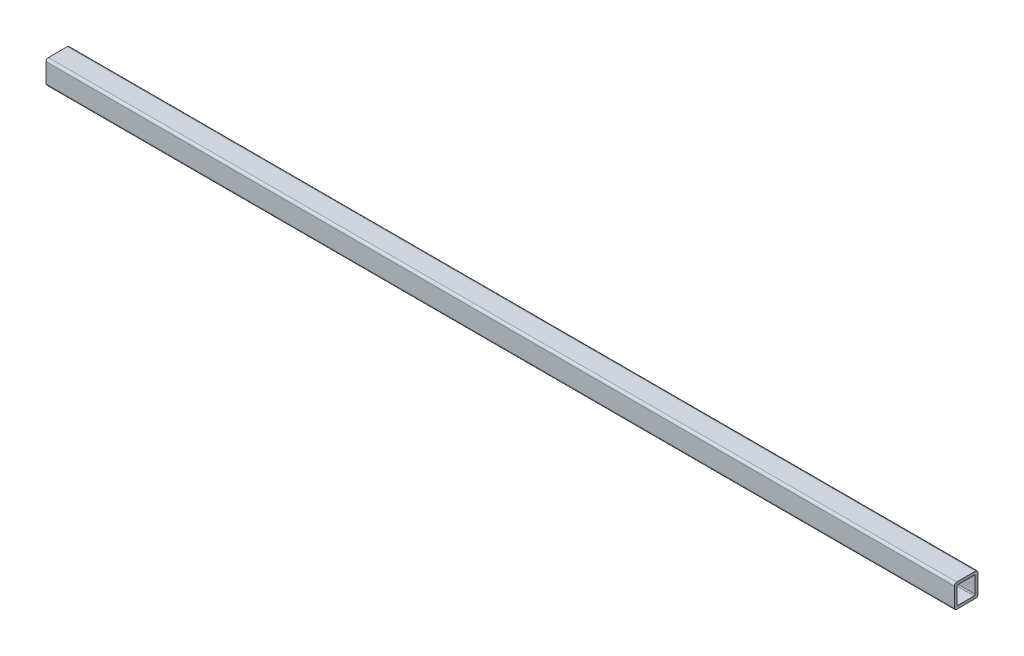
ISO-10303-21;
HEADER;
FILE_DESCRIPTION(('STEP AP214'),'2;1');
FILE_NAME('part.step','',(''),(''),'','','');
FILE_SCHEMA(('AUTOMOTIVE_DESIGN { 1 0 10303 214 1 1 1 1 }'));
ENDSEC;
DATA;
#1=APPLICATION_CONTEXT('core data for automotive mechanical design processes');
#2=APPLICATION_PROTOCOL_DEFINITION('international standard','automotive_design',2000,#1);
#3=PRODUCT_CONTEXT('',#1,'mechanical');
#4=PRODUCT('Part','Part','',(#3));
#5=PRODUCT_RELATED_PRODUCT_CATEGORY('part','',(#4));
#6=PRODUCT_DEFINITION_FORMATION('','',#4);
#7=PRODUCT_DEFINITION_CONTEXT('part definition',#1,'design');
#8=PRODUCT_DEFINITION('design','',#6,#7);
#9=PRODUCT_DEFINITION_SHAPE('','',#8);
#10=(LENGTH_UNIT() NAMED_UNIT(*) SI_UNIT(.MILLI.,.METRE.));
#11=(NAMED_UNIT(*) PLANE_ANGLE_UNIT() SI_UNIT($,.RADIAN.));
#12=(NAMED_UNIT(*) SI_UNIT($,.STERADIAN.) SOLID_ANGLE_UNIT());
#13=UNCERTAINTY_MEASURE_WITH_UNIT(LENGTH_MEASURE(1.E-05),#10,'distance_accuracy_value','');
#14=(GEOMETRIC_REPRESENTATION_CONTEXT(3) GLOBAL_UNCERTAINTY_ASSIGNED_CONTEXT((#13)) GLOBAL_UNIT_ASSIGNED_CONTEXT((#10,
#11,#12)) REPRESENTATION_CONTEXT('',''));
#15=CARTESIAN_POINT('',(0.,0.,0.));
#16=DIRECTION('',(0.,0.,1.));
#17=DIRECTION('',(1.,0.,0.));
#18=AXIS2_PLACEMENT_3D('',#15,#16,#17);
#19=CARTESIAN_POINT('',(-974.6,12.7,-12.7));
#20=DIRECTION('',(0.,0.,-1.));
#21=DIRECTION('',(0.,1.,0.));
#22=AXIS2_PLACEMENT_3D('',#19,#20,#21);
#23=PLANE('',#22);
#24=DIRECTION('',(0.,1.,0.));
#25=VECTOR('',#24,1.);
#26=CARTESIAN_POINT('',(0.,12.7,-12.7));
#27=LINE('',#26,#25);
#28=CARTESIAN_POINT('',(0.,-10.2,-12.7));
#29=VERTEX_POINT('',#28);
#30=CARTESIAN_POINT('',(0.,10.2,-12.7));
#31=VERTEX_POINT('',#30);
#32=EDGE_CURVE('E258',#29,#31,#27,.T.);
#33=ORIENTED_EDGE('',*,*,#32,.F.);
#34=DIRECTION('',(1.,0.,0.));
#35=VECTOR('',#34,1.);
#36=CARTESIAN_POINT('',(-974.6,-10.2,-12.7));
#37=LINE('',#36,#35);
#38=CARTESIAN_POINT('',(-974.6,-10.2,-12.7));
#39=VERTEX_POINT('',#38);
#40=EDGE_CURVE('E187',#29,#39,#37,.F.);
#41=ORIENTED_EDGE('',*,*,#40,.T.);
#42=DIRECTION('',(0.,1.,0.));
#43=VECTOR('',#42,1.);
#44=CARTESIAN_POINT('',(-974.6,12.7,-12.7));
#45=LINE('',#44,#43);
#46=CARTESIAN_POINT('',(-974.6,10.2,-12.7));
#47=VERTEX_POINT('',#46);
#48=EDGE_CURVE('E168',#39,#47,#45,.T.);
#49=ORIENTED_EDGE('',*,*,#48,.T.);
#50=DIRECTION('',(1.,0.,0.));
#51=VECTOR('',#50,1.);
#52=CARTESIAN_POINT('',(-974.6,10.2,-12.7));
#53=LINE('',#52,#51);
#54=EDGE_CURVE('E184',#47,#31,#53,.T.);
#55=ORIENTED_EDGE('',*,*,#54,.T.);
#56=EDGE_LOOP('',(#33,#41,#49,#55));
#57=FACE_BOUND('',#56,.T.);
#58=ADVANCED_FACE('F33',(#57),#23,.T.);
#59=CARTESIAN_POINT('',(-974.6,-12.7,12.7));
#60=DIRECTION('',(0.,-1.,0.));
#61=DIRECTION('',(0.,0.,-1.));
#62=AXIS2_PLACEMENT_3D('',#59,#60,#61);
#63=PLANE('',#62);
#64=DIRECTION('',(0.,0.,-1.));
#65=VECTOR('',#64,1.);
#66=CARTESIAN_POINT('',(-974.6,-12.7,12.7));
#67=LINE('',#66,#65);
#68=CARTESIAN_POINT('',(-974.6,-12.7,10.2));
#69=VERTEX_POINT('',#68);
#70=CARTESIAN_POINT('',(-974.6,-12.7,-10.2));
#71=VERTEX_POINT('',#70);
#72=EDGE_CURVE('E173',#69,#71,#67,.T.);
#73=ORIENTED_EDGE('',*,*,#72,.T.);
#74=DIRECTION('',(1.,0.,0.));
#75=VECTOR('',#74,1.);
#76=CARTESIAN_POINT('',(-974.6,-12.7,-10.2));
#77=LINE('',#76,#75);
#78=CARTESIAN_POINT('',(0.,-12.7,-10.2));
#79=VERTEX_POINT('',#78);
#80=EDGE_CURVE('E167',#71,#79,#77,.T.);
#81=ORIENTED_EDGE('',*,*,#80,.T.);
#82=DIRECTION('',(0.,0.,-1.));
#83=VECTOR('',#82,1.);
#84=CARTESIAN_POINT('',(0.,-12.7,12.7));
#85=LINE('',#84,#83);
#86=CARTESIAN_POINT('',(0.,-12.7,10.2));
#87=VERTEX_POINT('',#86);
#88=EDGE_CURVE('E150',#87,#79,#85,.T.);
#89=ORIENTED_EDGE('',*,*,#88,.F.);
#90=DIRECTION('',(1.,0.,0.));
#91=VECTOR('',#90,1.);
#92=CARTESIAN_POINT('',(-974.6,-12.7,10.2));
#93=LINE('',#92,#91);
#94=EDGE_CURVE('E164',#87,#69,#93,.F.);
#95=ORIENTED_EDGE('',*,*,#94,.T.);
#96=EDGE_LOOP('',(#73,#81,#89,#95));
#97=FACE_BOUND('',#96,.T.);
#98=ADVANCED_FACE('F163',(#97),#63,.T.);
#99=CARTESIAN_POINT('',(-974.6,12.7,12.7));
#100=DIRECTION('',(0.,0.,1.));
#101=DIRECTION('',(0.,-1.,0.));
#102=AXIS2_PLACEMENT_3D('',#99,#100,#101);
#103=PLANE('',#102);
#104=DIRECTION('',(0.,-1.,0.));
#105=VECTOR('',#104,1.);
#106=CARTESIAN_POINT('',(-974.6,12.7,12.7));
#107=LINE('',#106,#105);
#108=CARTESIAN_POINT('',(-974.6,10.2,12.7));
#109=VERTEX_POINT('',#108);
#110=CARTESIAN_POINT('',(-974.6,-10.2,12.7));
#111=VERTEX_POINT('',#110);
#112=EDGE_CURVE('E177',#109,#111,#107,.T.);
#113=ORIENTED_EDGE('',*,*,#112,.T.);
#114=DIRECTION('',(1.,0.,0.));
#115=VECTOR('',#114,1.);
#116=CARTESIAN_POINT('',(-974.6,-10.2,12.7));
#117=LINE('',#116,#115);
#118=CARTESIAN_POINT('',(0.,-10.2,12.7));
#119=VERTEX_POINT('',#118);
#120=EDGE_CURVE('E198',#111,#119,#117,.T.);
#121=ORIENTED_EDGE('',*,*,#120,.T.);
#122=DIRECTION('',(0.,-1.,0.));
#123=VECTOR('',#122,1.);
#124=CARTESIAN_POINT('',(0.,12.7,12.7));
#125=LINE('',#124,#123);
#126=CARTESIAN_POINT('',(0.,10.2,12.7));
#127=VERTEX_POINT('',#126);
#128=EDGE_CURVE('E152',#127,#119,#125,.T.);
#129=ORIENTED_EDGE('',*,*,#128,.F.);
#130=DIRECTION('',(1.,0.,0.));
#131=VECTOR('',#130,1.);
#132=CARTESIAN_POINT('',(-974.6,10.2,12.7));
#133=LINE('',#132,#131);
#134=EDGE_CURVE('E196',#127,#109,#133,.F.);
#135=ORIENTED_EDGE('',*,*,#134,.T.);
#136=EDGE_LOOP('',(#113,#121,#129,#135));
#137=FACE_BOUND('',#136,.T.);
#138=ADVANCED_FACE('F302',(#137),#103,.T.);
#139=CARTESIAN_POINT('',(-974.6,12.7,12.7));
#140=DIRECTION('',(0.,1.,0.));
#141=DIRECTION('',(0.,0.,1.));
#142=AXIS2_PLACEMENT_3D('',#139,#140,#141);
#143=PLANE('',#142);
#144=DIRECTION('',(0.,0.,1.));
#145=VECTOR('',#144,1.);
#146=CARTESIAN_POINT('',(0.,12.7,12.7));
#147=LINE('',#146,#145);
#148=CARTESIAN_POINT('',(0.,12.7,-10.2));
#149=VERTEX_POINT('',#148);
#150=CARTESIAN_POINT('',(0.,12.7,10.2));
#151=VERTEX_POINT('',#150);
#152=EDGE_CURVE('E261',#149,#151,#147,.T.);
#153=ORIENTED_EDGE('',*,*,#152,.F.);
#154=DIRECTION('',(1.,0.,0.));
#155=VECTOR('',#154,1.);
#156=CARTESIAN_POINT('',(-974.6,12.7,-10.2));
#157=LINE('',#156,#155);
#158=CARTESIAN_POINT('',(-974.6,12.7,-10.2));
#159=VERTEX_POINT('',#158);
#160=EDGE_CURVE('E203',#149,#159,#157,.F.);
#161=ORIENTED_EDGE('',*,*,#160,.T.);
#162=DIRECTION('',(0.,0.,1.));
#163=VECTOR('',#162,1.);
#164=CARTESIAN_POINT('',(-974.6,12.7,12.7));
#165=LINE('',#164,#163);
#166=CARTESIAN_POINT('',(-974.6,12.7,10.2));
#167=VERTEX_POINT('',#166);
#168=EDGE_CURVE('E276',#159,#167,#165,.T.);
#169=ORIENTED_EDGE('',*,*,#168,.T.);
#170=DIRECTION('',(1.,0.,0.));
#171=VECTOR('',#170,1.);
#172=CARTESIAN_POINT('',(-974.6,12.7,10.2));
#173=LINE('',#172,#171);
#174=EDGE_CURVE('E200',#167,#151,#173,.T.);
#175=ORIENTED_EDGE('',*,*,#174,.T.);
#176=EDGE_LOOP('',(#153,#161,#169,#175));
#177=FACE_BOUND('',#176,.T.);
#178=ADVANCED_FACE('F285',(#177),#143,.T.);
#179=CARTESIAN_POINT('',(-974.6,0.,0.));
#180=DIRECTION('',(1.,0.,0.));
#181=DIRECTION('',(0.,0.,-1.));
#182=AXIS2_PLACEMENT_3D('',#179,#180,#181);
#183=PLANE('',#182);
#184=DIRECTION('',(0.,-1.,0.));
#185=VECTOR('',#184,1.);
#186=CARTESIAN_POINT('',(-974.6,-9.652,9.652));
#187=LINE('',#186,#185);
#188=CARTESIAN_POINT('',(-974.6,8.652,9.652));
#189=VERTEX_POINT('',#188);
#190=CARTESIAN_POINT('',(-974.6,-8.652,9.652));
#191=VERTEX_POINT('',#190);
#192=EDGE_CURVE('E254',#189,#191,#187,.T.);
#193=ORIENTED_EDGE('',*,*,#192,.T.);
#194=CARTESIAN_POINT('',(-974.6,-8.652,8.652));
#195=DIRECTION('',(1.,0.,0.));
#196=DIRECTION('',(0.,0.,-1.));
#197=AXIS2_PLACEMENT_3D('',#194,#195,#196);
#198=CIRCLE('',#197,1.);
#199=CARTESIAN_POINT('',(-974.6,-9.652,8.652));
#200=VERTEX_POINT('',#199);
#201=EDGE_CURVE('E11',#191,#200,#198,.T.);
#202=ORIENTED_EDGE('',*,*,#201,.T.);
#203=DIRECTION('',(0.,0.,-1.));
#204=VECTOR('',#203,1.);
#205=CARTESIAN_POINT('',(-974.6,-9.652,9.652));
#206=LINE('',#205,#204);
#207=CARTESIAN_POINT('',(-974.6,-9.652,-8.652));
#208=VERTEX_POINT('',#207);
#209=EDGE_CURVE('E252',#200,#208,#206,.T.);
#210=ORIENTED_EDGE('',*,*,#209,.T.);
#211=CARTESIAN_POINT('',(-974.6,-8.652,-8.652));
#212=DIRECTION('',(1.,0.,0.));
#213=DIRECTION('',(0.,0.,-1.));
#214=AXIS2_PLACEMENT_3D('',#211,#212,#213);
#215=CIRCLE('',#214,1.);
#216=CARTESIAN_POINT('',(-974.6,-8.652,-9.652));
#217=VERTEX_POINT('',#216);
#218=EDGE_CURVE('E226',#208,#217,#215,.T.);
#219=ORIENTED_EDGE('',*,*,#218,.T.);
#220=DIRECTION('',(0.,1.,0.));
#221=VECTOR('',#220,1.);
#222=CARTESIAN_POINT('',(-974.6,-9.652,-9.652));
#223=LINE('',#222,#221);
#224=CARTESIAN_POINT('',(-974.6,8.652,-9.652));
#225=VERTEX_POINT('',#224);
#226=EDGE_CURVE('E273',#217,#225,#223,.T.);
#227=ORIENTED_EDGE('',*,*,#226,.T.);
#228=CARTESIAN_POINT('',(-974.6,8.652,-8.652));
#229=DIRECTION('',(1.,0.,0.));
#230=DIRECTION('',(0.,0.,-1.));
#231=AXIS2_PLACEMENT_3D('',#228,#229,#230);
#232=CIRCLE('',#231,1.);
#233=CARTESIAN_POINT('',(-974.6,9.652,-8.652));
#234=VERTEX_POINT('',#233);
#235=EDGE_CURVE('E230',#225,#234,#232,.T.);
#236=ORIENTED_EDGE('',*,*,#235,.T.);
#237=DIRECTION('',(0.,0.,1.));
#238=VECTOR('',#237,1.);
#239=CARTESIAN_POINT('',(-974.6,9.652,9.652));
#240=LINE('',#239,#238);
#241=CARTESIAN_POINT('',(-974.6,9.652,8.652));
#242=VERTEX_POINT('',#241);
#243=EDGE_CURVE('E263',#234,#242,#240,.T.);
#244=ORIENTED_EDGE('',*,*,#243,.T.);
#245=CARTESIAN_POINT('',(-974.6,8.652,8.652));
#246=DIRECTION('',(1.,0.,0.));
#247=DIRECTION('',(0.,0.,-1.));
#248=AXIS2_PLACEMENT_3D('',#245,#246,#247);
#249=CIRCLE('',#248,1.);
#250=EDGE_CURVE('E55',#242,#189,#249,.T.);
#251=ORIENTED_EDGE('',*,*,#250,.T.);
#252=EDGE_LOOP('',(#193,#202,#210,#219,#227,#236,#244,#251));
#253=FACE_BOUND('',#252,.T.);
#254=ORIENTED_EDGE('',*,*,#48,.F.);
#255=CARTESIAN_POINT('',(-974.6,-10.2,-10.2));
#256=DIRECTION('',(1.,0.,0.));
#257=DIRECTION('',(0.,0.,-1.));
#258=AXIS2_PLACEMENT_3D('',#255,#256,#257);
#259=CIRCLE('',#258,2.5);
#260=EDGE_CURVE('E194',#39,#71,#259,.F.);
#261=ORIENTED_EDGE('',*,*,#260,.T.);
#262=ORIENTED_EDGE('',*,*,#72,.F.);
#263=CARTESIAN_POINT('',(-974.6,-10.2,10.2));
#264=DIRECTION('',(1.,0.,0.));
#265=DIRECTION('',(0.,0.,-1.));
#266=AXIS2_PLACEMENT_3D('',#263,#264,#265);
#267=CIRCLE('',#266,2.5);
#268=EDGE_CURVE('E172',#69,#111,#267,.F.);
#269=ORIENTED_EDGE('',*,*,#268,.T.);
#270=ORIENTED_EDGE('',*,*,#112,.F.);
#271=CARTESIAN_POINT('',(-974.6,10.2,10.2));
#272=DIRECTION('',(1.,0.,0.));
#273=DIRECTION('',(0.,0.,-1.));
#274=AXIS2_PLACEMENT_3D('',#271,#272,#273);
#275=CIRCLE('',#274,2.5);
#276=EDGE_CURVE('E189',#109,#167,#275,.F.);
#277=ORIENTED_EDGE('',*,*,#276,.T.);
#278=ORIENTED_EDGE('',*,*,#168,.F.);
#279=CARTESIAN_POINT('',(-974.6,10.2,-10.2));
#280=DIRECTION('',(1.,0.,0.));
#281=DIRECTION('',(0.,0.,-1.));
#282=AXIS2_PLACEMENT_3D('',#279,#280,#281);
#283=CIRCLE('',#282,2.5);
#284=EDGE_CURVE('E191',#159,#47,#283,.F.);
#285=ORIENTED_EDGE('',*,*,#284,.T.);
#286=EDGE_LOOP('',(#254,#261,#262,#269,#270,#277,#278,#285));
#287=FACE_BOUND('',#286,.T.);
#288=ADVANCED_FACE('F250',(#253,#287),#183,.F.);
#289=CARTESIAN_POINT('',(0.,0.,0.));
#290=DIRECTION('',(1.,0.,0.));
#291=DIRECTION('',(0.,0.,-1.));
#292=AXIS2_PLACEMENT_3D('',#289,#290,#291);
#293=PLANE('',#292);
#294=DIRECTION('',(0.,1.,0.));
#295=VECTOR('',#294,1.);
#296=CARTESIAN_POINT('',(0.,-9.652,-9.652));
#297=LINE('',#296,#295);
#298=CARTESIAN_POINT('',(0.,-8.652,-9.652));
#299=VERTEX_POINT('',#298);
#300=CARTESIAN_POINT('',(0.,8.652,-9.652));
#301=VERTEX_POINT('',#300);
#302=EDGE_CURVE('E267',#299,#301,#297,.T.);
#303=ORIENTED_EDGE('',*,*,#302,.F.);
#304=CARTESIAN_POINT('',(0.,-8.652,-8.652));
#305=DIRECTION('',(1.,0.,0.));
#306=DIRECTION('',(0.,0.,-1.));
#307=AXIS2_PLACEMENT_3D('',#304,#305,#306);
#308=CIRCLE('',#307,1.);
#309=CARTESIAN_POINT('',(0.,-9.652,-8.652));
#310=VERTEX_POINT('',#309);
#311=EDGE_CURVE('E224',#299,#310,#308,.F.);
#312=ORIENTED_EDGE('',*,*,#311,.T.);
#313=DIRECTION('',(0.,0.,-1.));
#314=VECTOR('',#313,1.);
#315=CARTESIAN_POINT('',(0.,-9.652,9.652));
#316=LINE('',#315,#314);
#317=CARTESIAN_POINT('',(0.,-9.652,8.652));
#318=VERTEX_POINT('',#317);
#319=EDGE_CURVE('E240',#318,#310,#316,.T.);
#320=ORIENTED_EDGE('',*,*,#319,.F.);
#321=CARTESIAN_POINT('',(0.,-8.652,8.652));
#322=DIRECTION('',(1.,0.,0.));
#323=DIRECTION('',(0.,0.,-1.));
#324=AXIS2_PLACEMENT_3D('',#321,#322,#323);
#325=CIRCLE('',#324,1.);
#326=CARTESIAN_POINT('',(0.,-8.652,9.652));
#327=VERTEX_POINT('',#326);
#328=EDGE_CURVE('E41',#318,#327,#325,.F.);
#329=ORIENTED_EDGE('',*,*,#328,.T.);
#330=DIRECTION('',(0.,-1.,0.));
#331=VECTOR('',#330,1.);
#332=CARTESIAN_POINT('',(0.,-9.652,9.652));
#333=LINE('',#332,#331);
#334=CARTESIAN_POINT('',(0.,8.652,9.652));
#335=VERTEX_POINT('',#334);
#336=EDGE_CURVE('E238',#335,#327,#333,.T.);
#337=ORIENTED_EDGE('',*,*,#336,.F.);
#338=CARTESIAN_POINT('',(0.,8.652,8.652));
#339=DIRECTION('',(1.,0.,0.));
#340=DIRECTION('',(0.,0.,-1.));
#341=AXIS2_PLACEMENT_3D('',#338,#339,#340);
#342=CIRCLE('',#341,1.);
#343=CARTESIAN_POINT('',(0.,9.652,8.652));
#344=VERTEX_POINT('',#343);
#345=EDGE_CURVE('E232',#335,#344,#342,.F.);
#346=ORIENTED_EDGE('',*,*,#345,.T.);
#347=DIRECTION('',(0.,0.,1.));
#348=VECTOR('',#347,1.);
#349=CARTESIAN_POINT('',(0.,9.652,9.652));
#350=LINE('',#349,#348);
#351=CARTESIAN_POINT('',(0.,9.652,-8.652));
#352=VERTEX_POINT('',#351);
#353=EDGE_CURVE('E245',#352,#344,#350,.T.);
#354=ORIENTED_EDGE('',*,*,#353,.F.);
#355=CARTESIAN_POINT('',(0.,8.652,-8.652));
#356=DIRECTION('',(1.,0.,0.));
#357=DIRECTION('',(0.,0.,-1.));
#358=AXIS2_PLACEMENT_3D('',#355,#356,#357);
#359=CIRCLE('',#358,1.);
#360=EDGE_CURVE('E228',#352,#301,#359,.F.);
#361=ORIENTED_EDGE('',*,*,#360,.T.);
#362=EDGE_LOOP('',(#303,#312,#320,#329,#337,#346,#354,#361));
#363=FACE_BOUND('',#362,.T.);
#364=ORIENTED_EDGE('',*,*,#88,.T.);
#365=CARTESIAN_POINT('',(0.,-10.2,-10.2));
#366=DIRECTION('',(1.,0.,0.));
#367=DIRECTION('',(0.,0.,-1.));
#368=AXIS2_PLACEMENT_3D('',#365,#366,#367);
#369=CIRCLE('',#368,2.5);
#370=EDGE_CURVE('E157',#79,#29,#369,.T.);
#371=ORIENTED_EDGE('',*,*,#370,.T.);
#372=ORIENTED_EDGE('',*,*,#32,.T.);
#373=CARTESIAN_POINT('',(0.,10.2,-10.2));
#374=DIRECTION('',(1.,0.,0.));
#375=DIRECTION('',(0.,0.,-1.));
#376=AXIS2_PLACEMENT_3D('',#373,#374,#375);
#377=CIRCLE('',#376,2.5);
#378=EDGE_CURVE('E158',#31,#149,#377,.T.);
#379=ORIENTED_EDGE('',*,*,#378,.T.);
#380=ORIENTED_EDGE('',*,*,#152,.T.);
#381=CARTESIAN_POINT('',(0.,10.2,10.2));
#382=DIRECTION('',(1.,0.,0.));
#383=DIRECTION('',(0.,0.,-1.));
#384=AXIS2_PLACEMENT_3D('',#381,#382,#383);
#385=CIRCLE('',#384,2.5);
#386=EDGE_CURVE('E175',#151,#127,#385,.T.);
#387=ORIENTED_EDGE('',*,*,#386,.T.);
#388=ORIENTED_EDGE('',*,*,#128,.T.);
#389=CARTESIAN_POINT('',(0.,-10.2,10.2));
#390=DIRECTION('',(1.,0.,0.));
#391=DIRECTION('',(0.,0.,-1.));
#392=AXIS2_PLACEMENT_3D('',#389,#390,#391);
#393=CIRCLE('',#392,2.5);
#394=EDGE_CURVE('E147',#119,#87,#393,.T.);
#395=ORIENTED_EDGE('',*,*,#394,.T.);
#396=EDGE_LOOP('',(#364,#371,#372,#379,#380,#387,#388,#395));
#397=FACE_BOUND('',#396,.T.);
#398=ADVANCED_FACE('F149',(#363,#397),#293,.T.);
#399=CARTESIAN_POINT('',(-974.6,-9.652,-9.652));
#400=DIRECTION('',(0.,0.,-1.));
#401=DIRECTION('',(-1.,0.,0.));
#402=AXIS2_PLACEMENT_3D('',#399,#400,#401);
#403=PLANE('',#402);
#404=ORIENTED_EDGE('',*,*,#226,.F.);
#405=DIRECTION('',(1.,0.,0.));
#406=VECTOR('',#405,1.);
#407=CARTESIAN_POINT('',(0.,-8.652,-9.652));
#408=LINE('',#407,#406);
#409=EDGE_CURVE('E207',#217,#299,#408,.T.);
#410=ORIENTED_EDGE('',*,*,#409,.T.);
#411=ORIENTED_EDGE('',*,*,#302,.T.);
#412=DIRECTION('',(1.,0.,0.));
#413=VECTOR('',#412,1.);
#414=CARTESIAN_POINT('',(-974.6,8.652,-9.652));
#415=LINE('',#414,#413);
#416=EDGE_CURVE('E205',#301,#225,#415,.F.);
#417=ORIENTED_EDGE('',*,*,#416,.T.);
#418=EDGE_LOOP('',(#404,#410,#411,#417));
#419=FACE_BOUND('',#418,.T.);
#420=ADVANCED_FACE('F363',(#419),#403,.F.);
#421=CARTESIAN_POINT('',(-974.6,-9.652,9.652));
#422=DIRECTION('',(0.,-1.,0.));
#423=DIRECTION('',(0.,0.,-1.));
#424=AXIS2_PLACEMENT_3D('',#421,#422,#423);
#425=PLANE('',#424);
#426=ORIENTED_EDGE('',*,*,#319,.T.);
#427=DIRECTION('',(1.,0.,0.));
#428=VECTOR('',#427,1.);
#429=CARTESIAN_POINT('',(-974.6,-9.652,-8.652));
#430=LINE('',#429,#428);
#431=EDGE_CURVE('E213',#310,#208,#430,.F.);
#432=ORIENTED_EDGE('',*,*,#431,.T.);
#433=ORIENTED_EDGE('',*,*,#209,.F.);
#434=DIRECTION('',(1.,0.,0.));
#435=VECTOR('',#434,1.);
#436=CARTESIAN_POINT('',(0.,-9.652,8.652));
#437=LINE('',#436,#435);
#438=EDGE_CURVE('E210',#200,#318,#437,.T.);
#439=ORIENTED_EDGE('',*,*,#438,.T.);
#440=EDGE_LOOP('',(#426,#432,#433,#439));
#441=FACE_BOUND('',#440,.T.);
#442=ADVANCED_FACE('F256',(#441),#425,.F.);
#443=CARTESIAN_POINT('',(-974.6,-9.652,9.652));
#444=DIRECTION('',(0.,0.,1.));
#445=DIRECTION('',(1.,0.,0.));
#446=AXIS2_PLACEMENT_3D('',#443,#444,#445);
#447=PLANE('',#446);
#448=ORIENTED_EDGE('',*,*,#192,.F.);
#449=DIRECTION('',(1.,0.,0.));
#450=VECTOR('',#449,1.);
#451=CARTESIAN_POINT('',(0.,8.652,9.652));
#452=LINE('',#451,#450);
#453=EDGE_CURVE('E221',#189,#335,#452,.T.);
#454=ORIENTED_EDGE('',*,*,#453,.T.);
#455=ORIENTED_EDGE('',*,*,#336,.T.);
#456=DIRECTION('',(1.,0.,0.));
#457=VECTOR('',#456,1.);
#458=CARTESIAN_POINT('',(-974.6,-8.652,9.652));
#459=LINE('',#458,#457);
#460=EDGE_CURVE('E48',#327,#191,#459,.F.);
#461=ORIENTED_EDGE('',*,*,#460,.T.);
#462=EDGE_LOOP('',(#448,#454,#455,#461));
#463=FACE_BOUND('',#462,.T.);
#464=ADVANCED_FACE('F243',(#463),#447,.F.);
#465=CARTESIAN_POINT('',(-974.6,9.652,9.652));
#466=DIRECTION('',(0.,1.,0.));
#467=DIRECTION('',(0.,0.,1.));
#468=AXIS2_PLACEMENT_3D('',#465,#466,#467);
#469=PLANE('',#468);
#470=ORIENTED_EDGE('',*,*,#243,.F.);
#471=DIRECTION('',(1.,0.,0.));
#472=VECTOR('',#471,1.);
#473=CARTESIAN_POINT('',(0.,9.652,-8.652));
#474=LINE('',#473,#472);
#475=EDGE_CURVE('E217',#234,#352,#474,.T.);
#476=ORIENTED_EDGE('',*,*,#475,.T.);
#477=ORIENTED_EDGE('',*,*,#353,.T.);
#478=DIRECTION('',(1.,0.,0.));
#479=VECTOR('',#478,1.);
#480=CARTESIAN_POINT('',(-974.6,9.652,8.652));
#481=LINE('',#480,#479);
#482=EDGE_CURVE('E215',#344,#242,#481,.F.);
#483=ORIENTED_EDGE('',*,*,#482,.T.);
#484=EDGE_LOOP('',(#470,#476,#477,#483));
#485=FACE_BOUND('',#484,.T.);
#486=ADVANCED_FACE('F328',(#485),#469,.F.);
#487=CARTESIAN_POINT('',(-974.6,-10.2,-10.2));
#488=DIRECTION('',(1.,0.,0.));
#489=DIRECTION('',(0.,0.,-1.));
#490=AXIS2_PLACEMENT_3D('',#487,#488,#489);
#491=CYLINDRICAL_SURFACE('',#490,2.5);
#492=ORIENTED_EDGE('',*,*,#260,.F.);
#493=ORIENTED_EDGE('',*,*,#40,.F.);
#494=ORIENTED_EDGE('',*,*,#370,.F.);
#495=ORIENTED_EDGE('',*,*,#80,.F.);
#496=EDGE_LOOP('',(#492,#493,#494,#495));
#497=FACE_BOUND('',#496,.T.);
#498=ADVANCED_FACE('F298',(#497),#491,.T.);
#499=CARTESIAN_POINT('',(-974.6,-10.2,10.2));
#500=DIRECTION('',(1.,0.,0.));
#501=DIRECTION('',(0.,0.,-1.));
#502=AXIS2_PLACEMENT_3D('',#499,#500,#501);
#503=CYLINDRICAL_SURFACE('',#502,2.5);
#504=ORIENTED_EDGE('',*,*,#268,.F.);
#505=ORIENTED_EDGE('',*,*,#94,.F.);
#506=ORIENTED_EDGE('',*,*,#394,.F.);
#507=ORIENTED_EDGE('',*,*,#120,.F.);
#508=EDGE_LOOP('',(#504,#505,#506,#507));
#509=FACE_BOUND('',#508,.T.);
#510=ADVANCED_FACE('F171',(#509),#503,.T.);
#511=CARTESIAN_POINT('',(-974.6,10.2,-10.2));
#512=DIRECTION('',(1.,0.,0.));
#513=DIRECTION('',(0.,0.,-1.));
#514=AXIS2_PLACEMENT_3D('',#511,#512,#513);
#515=CYLINDRICAL_SURFACE('',#514,2.5);
#516=ORIENTED_EDGE('',*,*,#284,.F.);
#517=ORIENTED_EDGE('',*,*,#160,.F.);
#518=ORIENTED_EDGE('',*,*,#378,.F.);
#519=ORIENTED_EDGE('',*,*,#54,.F.);
#520=EDGE_LOOP('',(#516,#517,#518,#519));
#521=FACE_BOUND('',#520,.T.);
#522=ADVANCED_FACE('F290',(#521),#515,.T.);
#523=CARTESIAN_POINT('',(-974.6,10.2,10.2));
#524=DIRECTION('',(1.,0.,0.));
#525=DIRECTION('',(0.,0.,-1.));
#526=AXIS2_PLACEMENT_3D('',#523,#524,#525);
#527=CYLINDRICAL_SURFACE('',#526,2.5);
#528=ORIENTED_EDGE('',*,*,#276,.F.);
#529=ORIENTED_EDGE('',*,*,#134,.F.);
#530=ORIENTED_EDGE('',*,*,#386,.F.);
#531=ORIENTED_EDGE('',*,*,#174,.F.);
#532=EDGE_LOOP('',(#528,#529,#530,#531));
#533=FACE_BOUND('',#532,.T.);
#534=ADVANCED_FACE('F305',(#533),#527,.T.);
#535=CARTESIAN_POINT('',(-974.6,-8.652,-8.652));
#536=DIRECTION('',(-1.,0.,0.));
#537=DIRECTION('',(0.,0.,1.));
#538=AXIS2_PLACEMENT_3D('',#535,#536,#537);
#539=CYLINDRICAL_SURFACE('',#538,1.);
#540=ORIENTED_EDGE('',*,*,#218,.F.);
#541=ORIENTED_EDGE('',*,*,#431,.F.);
#542=ORIENTED_EDGE('',*,*,#311,.F.);
#543=ORIENTED_EDGE('',*,*,#409,.F.);
#544=EDGE_LOOP('',(#540,#541,#542,#543));
#545=FACE_BOUND('',#544,.T.);
#546=ADVANCED_FACE('F307',(#545),#539,.F.);
#547=CARTESIAN_POINT('',(-974.6,8.652,-8.652));
#548=DIRECTION('',(-1.,0.,0.));
#549=DIRECTION('',(0.,0.,1.));
#550=AXIS2_PLACEMENT_3D('',#547,#548,#549);
#551=CYLINDRICAL_SURFACE('',#550,1.);
#552=ORIENTED_EDGE('',*,*,#235,.F.);
#553=ORIENTED_EDGE('',*,*,#416,.F.);
#554=ORIENTED_EDGE('',*,*,#360,.F.);
#555=ORIENTED_EDGE('',*,*,#475,.F.);
#556=EDGE_LOOP('',(#552,#553,#554,#555));
#557=FACE_BOUND('',#556,.T.);
#558=ADVANCED_FACE('F313',(#557),#551,.F.);
#559=CARTESIAN_POINT('',(-974.6,8.652,8.652));
#560=DIRECTION('',(-1.,0.,0.));
#561=DIRECTION('',(0.,0.,1.));
#562=AXIS2_PLACEMENT_3D('',#559,#560,#561);
#563=CYLINDRICAL_SURFACE('',#562,1.);
#564=ORIENTED_EDGE('',*,*,#250,.F.);
#565=ORIENTED_EDGE('',*,*,#482,.F.);
#566=ORIENTED_EDGE('',*,*,#345,.F.);
#567=ORIENTED_EDGE('',*,*,#453,.F.);
#568=EDGE_LOOP('',(#564,#565,#566,#567));
#569=FACE_BOUND('',#568,.T.);
#570=ADVANCED_FACE('F411',(#569),#563,.F.);
#571=CARTESIAN_POINT('',(-974.6,-8.652,8.652));
#572=DIRECTION('',(-1.,0.,0.));
#573=DIRECTION('',(0.,0.,1.));
#574=AXIS2_PLACEMENT_3D('',#571,#572,#573);
#575=CYLINDRICAL_SURFACE('',#574,1.);
#576=ORIENTED_EDGE('',*,*,#201,.F.);
#577=ORIENTED_EDGE('',*,*,#460,.F.);
#578=ORIENTED_EDGE('',*,*,#328,.F.);
#579=ORIENTED_EDGE('',*,*,#438,.F.);
#580=EDGE_LOOP('',(#576,#577,#578,#579));
#581=FACE_BOUND('',#580,.T.);
#582=ADVANCED_FACE('F35',(#581),#575,.F.);
#583=CLOSED_SHELL('',(#58,#98,#138,#178,#288,#398,#420,#442,#464,#486,#498,#510,#522,#534,#546,
#558,#570,#582));
#584=MANIFOLD_SOLID_BREP('B2',#583);
#585=ADVANCED_BREP_SHAPE_REPRESENTATION('',(#18,#584),#14);
#586=SHAPE_DEFINITION_REPRESENTATION(#9,#585);
ENDSEC;
END-ISO-10303-21;
